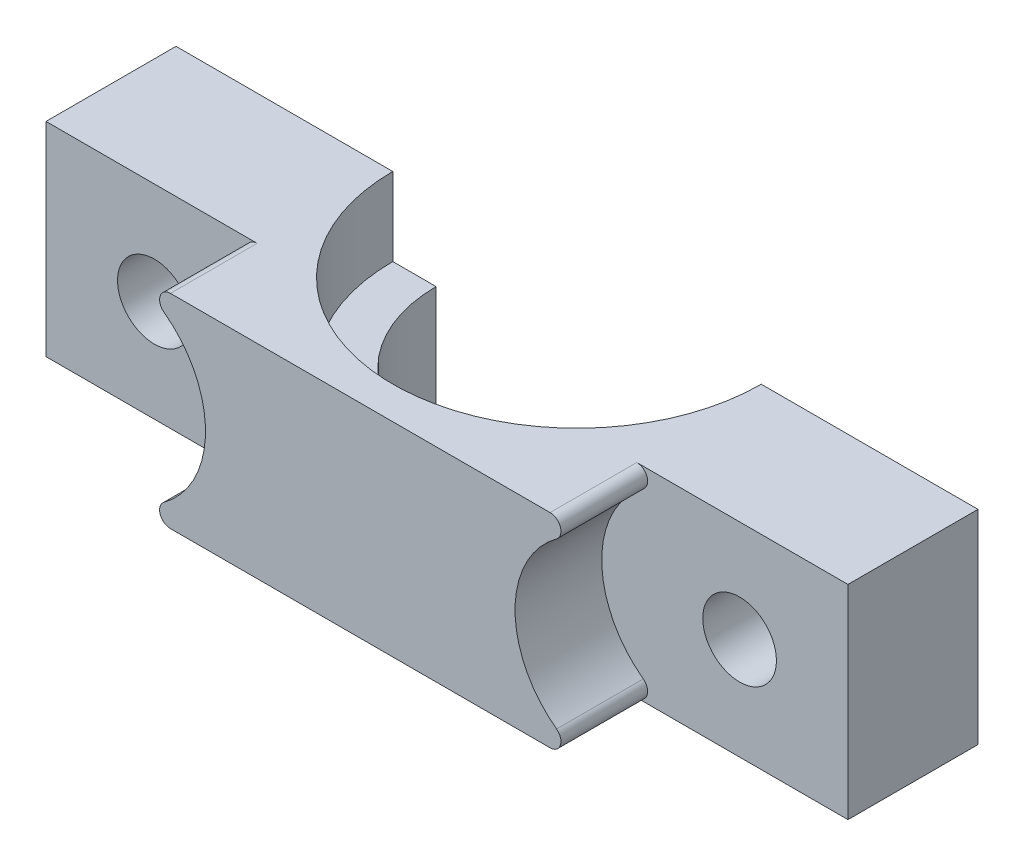
ISO-10303-21;
HEADER;
FILE_DESCRIPTION(('STEP AP214'),'2;1');
FILE_NAME('part.step','',(''),(''),'','','');
FILE_SCHEMA(('AUTOMOTIVE_DESIGN { 1 0 10303 214 1 1 1 1 }'));
ENDSEC;
DATA;
#1=APPLICATION_CONTEXT('core data for automotive mechanical design processes');
#2=APPLICATION_PROTOCOL_DEFINITION('international standard','automotive_design',2000,#1);
#3=PRODUCT_CONTEXT('',#1,'mechanical');
#4=PRODUCT('Part','Part','',(#3));
#5=PRODUCT_RELATED_PRODUCT_CATEGORY('part','',(#4));
#6=PRODUCT_DEFINITION_FORMATION('','',#4);
#7=PRODUCT_DEFINITION_CONTEXT('part definition',#1,'design');
#8=PRODUCT_DEFINITION('design','',#6,#7);
#9=PRODUCT_DEFINITION_SHAPE('','',#8);
#10=(LENGTH_UNIT() NAMED_UNIT(*) SI_UNIT(.MILLI.,.METRE.));
#11=(NAMED_UNIT(*) PLANE_ANGLE_UNIT() SI_UNIT($,.RADIAN.));
#12=(NAMED_UNIT(*) SI_UNIT($,.STERADIAN.) SOLID_ANGLE_UNIT());
#13=UNCERTAINTY_MEASURE_WITH_UNIT(LENGTH_MEASURE(1.E-05),#10,'distance_accuracy_value','');
#14=(GEOMETRIC_REPRESENTATION_CONTEXT(3) GLOBAL_UNCERTAINTY_ASSIGNED_CONTEXT((#13)) GLOBAL_UNIT_ASSIGNED_CONTEXT((#10,
#11,#12)) REPRESENTATION_CONTEXT('',''));
#15=CARTESIAN_POINT('',(0.,0.,0.));
#16=DIRECTION('',(0.,0.,1.));
#17=DIRECTION('',(1.,0.,0.));
#18=AXIS2_PLACEMENT_3D('',#15,#16,#17);
#19=CARTESIAN_POINT('',(-18.5,5.8,-9.99999999999999));
#20=DIRECTION('',(1.,0.,0.));
#21=DIRECTION('',(0.,0.,-1.));
#22=AXIS2_PLACEMENT_3D('',#19,#20,#21);
#23=PLANE('',#22);
#24=DIRECTION('',(0.,-1.,0.));
#25=VECTOR('',#24,1.);
#26=CARTESIAN_POINT('',(-18.5,9.4,-4.));
#27=LINE('',#26,#25);
#28=CARTESIAN_POINT('',(-18.5,9.4,-4.));
#29=VERTEX_POINT('',#28);
#30=CARTESIAN_POINT('',(-18.5,0.,-4.));
#31=VERTEX_POINT('',#30);
#32=EDGE_CURVE('E315',#29,#31,#27,.T.);
#33=ORIENTED_EDGE('',*,*,#32,.F.);
#34=DIRECTION('',(0.,0.,1.));
#35=VECTOR('',#34,1.);
#36=CARTESIAN_POINT('',(-18.5,9.4,-9.99999999999999));
#37=LINE('',#36,#35);
#38=CARTESIAN_POINT('',(-18.5,9.4,-9.99999999999999));
#39=VERTEX_POINT('',#38);
#40=EDGE_CURVE('E295',#39,#29,#37,.T.);
#41=ORIENTED_EDGE('',*,*,#40,.F.);
#42=DIRECTION('',(0.,-1.,0.));
#43=VECTOR('',#42,1.);
#44=CARTESIAN_POINT('',(-18.5,5.8,-9.99999999999999));
#45=LINE('',#44,#43);
#46=CARTESIAN_POINT('',(-18.5,0.,-9.99999999999999));
#47=VERTEX_POINT('',#46);
#48=EDGE_CURVE('E183',#39,#47,#45,.T.);
#49=ORIENTED_EDGE('',*,*,#48,.T.);
#50=DIRECTION('',(0.,0.,1.));
#51=VECTOR('',#50,1.);
#52=CARTESIAN_POINT('',(-18.5,0.,-9.99999999999999));
#53=LINE('',#52,#51);
#54=EDGE_CURVE('E175',#47,#31,#53,.T.);
#55=ORIENTED_EDGE('',*,*,#54,.T.);
#56=EDGE_LOOP('',(#33,#41,#49,#55));
#57=FACE_BOUND('',#56,.T.);
#58=ADVANCED_FACE('F36',(#57),#23,.F.);
#59=CARTESIAN_POINT('',(-13.5,4.7,0.));
#60=DIRECTION('',(0.,0.,1.));
#61=DIRECTION('',(1.,0.,0.));
#62=AXIS2_PLACEMENT_3D('',#59,#60,#61);
#63=CYLINDRICAL_SURFACE('',#62,1.69999999999999);
#64=CARTESIAN_POINT('',(-13.5,4.7,-10.));
#65=DIRECTION('',(0.,0.,1.));
#66=DIRECTION('',(1.,0.,0.));
#67=AXIS2_PLACEMENT_3D('',#64,#65,#66);
#68=CIRCLE('',#67,1.69999999999999);
#69=CARTESIAN_POINT('',(-11.8,4.7,-10.));
#70=VERTEX_POINT('',#69);
#71=EDGE_CURVE('E231',#70,#70,#68,.T.);
#72=ORIENTED_EDGE('',*,*,#71,.F.);
#73=EDGE_LOOP('',(#72));
#74=FACE_BOUND('',#73,.T.);
#75=CARTESIAN_POINT('',(-13.5,4.7,-4.));
#76=DIRECTION('',(0.,0.,1.));
#77=DIRECTION('',(1.,0.,0.));
#78=AXIS2_PLACEMENT_3D('',#75,#76,#77);
#79=CIRCLE('',#78,1.69999999999999);
#80=CARTESIAN_POINT('',(-11.8,4.7,-4.));
#81=VERTEX_POINT('',#80);
#82=EDGE_CURVE('E234',#81,#81,#79,.F.);
#83=ORIENTED_EDGE('',*,*,#82,.F.);
#84=EDGE_LOOP('',(#83));
#85=FACE_BOUND('',#84,.T.);
#86=ADVANCED_FACE('F349',(#74,#85),#63,.F.);
#87=CARTESIAN_POINT('',(0.,5.8,-9.99999999999999));
#88=DIRECTION('',(0.,-1.,0.));
#89=DIRECTION('',(0.,0.,-1.));
#90=AXIS2_PLACEMENT_3D('',#87,#88,#89);
#91=PLANE('',#90);
#92=CARTESIAN_POINT('',(0.,5.8,-9.99999999999999));
#93=DIRECTION('',(0.,-1.,0.));
#94=DIRECTION('',(0.,0.,1.));
#95=AXIS2_PLACEMENT_3D('',#92,#93,#94);
#96=CIRCLE('',#95,8.5);
#97=CARTESIAN_POINT('',(8.5,5.8,-10.));
#98=VERTEX_POINT('',#97);
#99=CARTESIAN_POINT('',(-8.5,5.8,-10.));
#100=VERTEX_POINT('',#99);
#101=EDGE_CURVE('E230',#98,#100,#96,.T.);
#102=ORIENTED_EDGE('',*,*,#101,.F.);
#103=DIRECTION('',(-1.,0.,0.));
#104=VECTOR('',#103,1.);
#105=CARTESIAN_POINT('',(18.5,5.8,-10.));
#106=LINE('',#105,#104);
#107=CARTESIAN_POINT('',(6.5,5.8,-10.));
#108=VERTEX_POINT('',#107);
#109=EDGE_CURVE('E182',#98,#108,#106,.T.);
#110=ORIENTED_EDGE('',*,*,#109,.T.);
#111=CARTESIAN_POINT('',(0.,5.8,-9.99999999999999));
#112=DIRECTION('',(0.,-1.,0.));
#113=DIRECTION('',(0.,0.,-1.));
#114=AXIS2_PLACEMENT_3D('',#111,#112,#113);
#115=CIRCLE('',#114,6.5);
#116=CARTESIAN_POINT('',(-6.5,5.8,-10.));
#117=VERTEX_POINT('',#116);
#118=EDGE_CURVE('E198',#108,#117,#115,.T.);
#119=ORIENTED_EDGE('',*,*,#118,.T.);
#120=DIRECTION('',(-1.,0.,0.));
#121=VECTOR('',#120,1.);
#122=CARTESIAN_POINT('',(-6.5,5.8,-10.));
#123=LINE('',#122,#121);
#124=EDGE_CURVE('E187',#117,#100,#123,.T.);
#125=ORIENTED_EDGE('',*,*,#124,.T.);
#126=EDGE_LOOP('',(#102,#110,#119,#125));
#127=FACE_BOUND('',#126,.T.);
#128=ADVANCED_FACE('F354',(#127),#91,.F.);
#129=CARTESIAN_POINT('',(-18.5,5.8,0.));
#130=DIRECTION('',(0.,0.,-1.));
#131=DIRECTION('',(-1.,0.,0.));
#132=AXIS2_PLACEMENT_3D('',#129,#130,#131);
#133=PLANE('',#132);
#134=CARTESIAN_POINT('',(11.8633873406451,4.7,0.));
#135=DIRECTION('',(0.,0.,1.));
#136=DIRECTION('',(-1.,0.,0.));
#137=AXIS2_PLACEMENT_3D('',#134,#135,#136);
#138=CIRCLE('',#137,4.72322755184711);
#139=CARTESIAN_POINT('',(9.05545994025603,8.49794973909238,0.));
#140=VERTEX_POINT('',#139);
#141=CARTESIAN_POINT('',(9.05545994025604,0.902050260907619,0.));
#142=VERTEX_POINT('',#141);
#143=EDGE_CURVE('E319',#140,#142,#138,.T.);
#144=ORIENTED_EDGE('',*,*,#143,.F.);
#145=CARTESIAN_POINT('',(8.75821326205069,8.9,0.));
#146=DIRECTION('',(0.,0.,-1.));
#147=DIRECTION('',(-1.,0.,0.));
#148=AXIS2_PLACEMENT_3D('',#145,#146,#147);
#149=CIRCLE('',#148,0.5);
#150=CARTESIAN_POINT('',(8.75821326205069,9.4,0.));
#151=VERTEX_POINT('',#150);
#152=EDGE_CURVE('E251',#140,#151,#149,.F.);
#153=ORIENTED_EDGE('',*,*,#152,.T.);
#154=DIRECTION('',(1.,0.,0.));
#155=VECTOR('',#154,1.);
#156=CARTESIAN_POINT('',(-18.5,9.4,0.));
#157=LINE('',#156,#155);
#158=CARTESIAN_POINT('',(-8.75821326205069,9.4,0.));
#159=VERTEX_POINT('',#158);
#160=EDGE_CURVE('E287',#159,#151,#157,.T.);
#161=ORIENTED_EDGE('',*,*,#160,.F.);
#162=CARTESIAN_POINT('',(-8.75821326205069,8.9,0.));
#163=DIRECTION('',(0.,0.,-1.));
#164=DIRECTION('',(-1.,0.,0.));
#165=AXIS2_PLACEMENT_3D('',#162,#163,#164);
#166=CIRCLE('',#165,0.5);
#167=CARTESIAN_POINT('',(-9.05545994025604,8.49794973909238,0.));
#168=VERTEX_POINT('',#167);
#169=EDGE_CURVE('E249',#159,#168,#166,.F.);
#170=ORIENTED_EDGE('',*,*,#169,.T.);
#171=CARTESIAN_POINT('',(-11.8633873406451,4.7,0.));
#172=DIRECTION('',(0.,0.,1.));
#173=DIRECTION('',(1.,0.,0.));
#174=AXIS2_PLACEMENT_3D('',#171,#172,#173);
#175=CIRCLE('',#174,4.72322755184711);
#176=CARTESIAN_POINT('',(-9.05545994025604,0.90205026090762,0.));
#177=VERTEX_POINT('',#176);
#178=EDGE_CURVE('E240',#177,#168,#175,.T.);
#179=ORIENTED_EDGE('',*,*,#178,.F.);
#180=CARTESIAN_POINT('',(-8.75821326205069,0.5,0.));
#181=DIRECTION('',(0.,0.,-1.));
#182=DIRECTION('',(-1.,0.,0.));
#183=AXIS2_PLACEMENT_3D('',#180,#181,#182);
#184=CIRCLE('',#183,0.5);
#185=CARTESIAN_POINT('',(-8.75821326205069,0.,0.));
#186=VERTEX_POINT('',#185);
#187=EDGE_CURVE('E245',#177,#186,#184,.F.);
#188=ORIENTED_EDGE('',*,*,#187,.T.);
#189=DIRECTION('',(1.,0.,0.));
#190=VECTOR('',#189,1.);
#191=CARTESIAN_POINT('',(-18.5,0.,0.));
#192=LINE('',#191,#190);
#193=CARTESIAN_POINT('',(8.75821326205069,0.,0.));
#194=VERTEX_POINT('',#193);
#195=EDGE_CURVE('E170',#186,#194,#192,.T.);
#196=ORIENTED_EDGE('',*,*,#195,.T.);
#197=CARTESIAN_POINT('',(8.75821326205069,0.5,0.));
#198=DIRECTION('',(0.,0.,-1.));
#199=DIRECTION('',(-1.,0.,0.));
#200=AXIS2_PLACEMENT_3D('',#197,#198,#199);
#201=CIRCLE('',#200,0.5);
#202=EDGE_CURVE('E247',#194,#142,#201,.F.);
#203=ORIENTED_EDGE('',*,*,#202,.T.);
#204=EDGE_LOOP('',(#144,#153,#161,#170,#179,#188,#196,#203));
#205=FACE_BOUND('',#204,.T.);
#206=ADVANCED_FACE('F292',(#205),#133,.F.);
#207=CARTESIAN_POINT('',(18.5,5.8,0.));
#208=DIRECTION('',(-1.,0.,0.));
#209=DIRECTION('',(0.,0.,1.));
#210=AXIS2_PLACEMENT_3D('',#207,#208,#209);
#211=PLANE('',#210);
#212=DIRECTION('',(0.,0.,-1.));
#213=VECTOR('',#212,1.);
#214=CARTESIAN_POINT('',(18.5,9.4,0.));
#215=LINE('',#214,#213);
#216=CARTESIAN_POINT('',(18.5,9.4,-4.));
#217=VERTEX_POINT('',#216);
#218=CARTESIAN_POINT('',(18.5,9.4,-10.));
#219=VERTEX_POINT('',#218);
#220=EDGE_CURVE('E163',#217,#219,#215,.T.);
#221=ORIENTED_EDGE('',*,*,#220,.F.);
#222=DIRECTION('',(0.,1.,0.));
#223=VECTOR('',#222,1.);
#224=CARTESIAN_POINT('',(18.5,9.4,-4.));
#225=LINE('',#224,#223);
#226=CARTESIAN_POINT('',(18.5,0.,-4.));
#227=VERTEX_POINT('',#226);
#228=EDGE_CURVE('E150',#227,#217,#225,.T.);
#229=ORIENTED_EDGE('',*,*,#228,.F.);
#230=DIRECTION('',(0.,0.,-1.));
#231=VECTOR('',#230,1.);
#232=CARTESIAN_POINT('',(18.5,0.,0.));
#233=LINE('',#232,#231);
#234=CARTESIAN_POINT('',(18.5,0.,-10.));
#235=VERTEX_POINT('',#234);
#236=EDGE_CURVE('E161',#227,#235,#233,.T.);
#237=ORIENTED_EDGE('',*,*,#236,.T.);
#238=DIRECTION('',(0.,-1.,0.));
#239=VECTOR('',#238,1.);
#240=CARTESIAN_POINT('',(18.5,5.8,-10.));
#241=LINE('',#240,#239);
#242=EDGE_CURVE('E193',#219,#235,#241,.T.);
#243=ORIENTED_EDGE('',*,*,#242,.F.);
#244=EDGE_LOOP('',(#221,#229,#237,#243));
#245=FACE_BOUND('',#244,.T.);
#246=ADVANCED_FACE('F159',(#245),#211,.F.);
#247=CARTESIAN_POINT('',(18.5,5.8,-10.));
#248=DIRECTION('',(0.,0.,1.));
#249=DIRECTION('',(1.,0.,0.));
#250=AXIS2_PLACEMENT_3D('',#247,#248,#249);
#251=PLANE('',#250);
#252=CARTESIAN_POINT('',(13.5,4.7,-10.));
#253=DIRECTION('',(0.,0.,1.));
#254=DIRECTION('',(1.,0.,0.));
#255=AXIS2_PLACEMENT_3D('',#252,#253,#254);
#256=CIRCLE('',#255,1.69999999999999);
#257=CARTESIAN_POINT('',(15.2,4.7,-10.));
#258=VERTEX_POINT('',#257);
#259=EDGE_CURVE('E227',#258,#258,#256,.T.);
#260=ORIENTED_EDGE('',*,*,#259,.T.);
#261=EDGE_LOOP('',(#260));
#262=FACE_BOUND('',#261,.T.);
#263=DIRECTION('',(-1.,0.,0.));
#264=VECTOR('',#263,1.);
#265=CARTESIAN_POINT('',(18.5,0.,-10.));
#266=LINE('',#265,#264);
#267=CARTESIAN_POINT('',(6.5,0.,-10.));
#268=VERTEX_POINT('',#267);
#269=EDGE_CURVE('E169',#235,#268,#266,.T.);
#270=ORIENTED_EDGE('',*,*,#269,.T.);
#271=DIRECTION('',(0.,-1.,0.));
#272=VECTOR('',#271,1.);
#273=CARTESIAN_POINT('',(6.5,5.8,-10.));
#274=LINE('',#273,#272);
#275=EDGE_CURVE('E190',#108,#268,#274,.T.);
#276=ORIENTED_EDGE('',*,*,#275,.F.);
#277=ORIENTED_EDGE('',*,*,#109,.F.);
#278=DIRECTION('',(0.,-1.,0.));
#279=VECTOR('',#278,1.);
#280=CARTESIAN_POINT('',(8.5,9.4,-10.));
#281=LINE('',#280,#279);
#282=CARTESIAN_POINT('',(8.5,9.4,-10.));
#283=VERTEX_POINT('',#282);
#284=EDGE_CURVE('E208',#283,#98,#281,.T.);
#285=ORIENTED_EDGE('',*,*,#284,.F.);
#286=DIRECTION('',(-1.,0.,0.));
#287=VECTOR('',#286,1.);
#288=CARTESIAN_POINT('',(18.5,9.4,-10.));
#289=LINE('',#288,#287);
#290=EDGE_CURVE('E297',#219,#283,#289,.T.);
#291=ORIENTED_EDGE('',*,*,#290,.F.);
#292=ORIENTED_EDGE('',*,*,#242,.T.);
#293=EDGE_LOOP('',(#270,#276,#277,#285,#291,#292));
#294=FACE_BOUND('',#293,.T.);
#295=ADVANCED_FACE('F460',(#262,#294),#251,.F.);
#296=CARTESIAN_POINT('',(0.,5.8,-9.99999999999999));
#297=DIRECTION('',(0.,-1.,0.));
#298=DIRECTION('',(0.,0.,-1.));
#299=AXIS2_PLACEMENT_3D('',#296,#297,#298);
#300=CYLINDRICAL_SURFACE('',#299,6.5);
#301=CARTESIAN_POINT('',(0.,0.,-9.99999999999999));
#302=DIRECTION('',(0.,-1.,0.));
#303=DIRECTION('',(0.,0.,-1.));
#304=AXIS2_PLACEMENT_3D('',#301,#302,#303);
#305=CIRCLE('',#304,6.5);
#306=CARTESIAN_POINT('',(-6.5,0.,-10.));
#307=VERTEX_POINT('',#306);
#308=EDGE_CURVE('E172',#268,#307,#305,.T.);
#309=ORIENTED_EDGE('',*,*,#308,.T.);
#310=DIRECTION('',(0.,-1.,0.));
#311=VECTOR('',#310,1.);
#312=CARTESIAN_POINT('',(-6.5,5.8,-10.));
#313=LINE('',#312,#311);
#314=EDGE_CURVE('E186',#117,#307,#313,.T.);
#315=ORIENTED_EDGE('',*,*,#314,.F.);
#316=ORIENTED_EDGE('',*,*,#118,.F.);
#317=ORIENTED_EDGE('',*,*,#275,.T.);
#318=EDGE_LOOP('',(#309,#315,#316,#317));
#319=FACE_BOUND('',#318,.T.);
#320=ADVANCED_FACE('F479',(#319),#300,.F.);
#321=CARTESIAN_POINT('',(-6.5,5.8,-10.));
#322=DIRECTION('',(0.,0.,1.));
#323=DIRECTION('',(1.,0.,0.));
#324=AXIS2_PLACEMENT_3D('',#321,#322,#323);
#325=PLANE('',#324);
#326=ORIENTED_EDGE('',*,*,#71,.T.);
#327=EDGE_LOOP('',(#326));
#328=FACE_BOUND('',#327,.T.);
#329=DIRECTION('',(-1.,0.,0.));
#330=VECTOR('',#329,1.);
#331=CARTESIAN_POINT('',(-6.5,0.,-10.));
#332=LINE('',#331,#330);
#333=EDGE_CURVE('E180',#307,#47,#332,.T.);
#334=ORIENTED_EDGE('',*,*,#333,.T.);
#335=ORIENTED_EDGE('',*,*,#48,.F.);
#336=DIRECTION('',(-1.,0.,0.));
#337=VECTOR('',#336,1.);
#338=CARTESIAN_POINT('',(-18.5,9.4,-9.99999999999999));
#339=LINE('',#338,#337);
#340=CARTESIAN_POINT('',(-8.5,9.4,-10.));
#341=VERTEX_POINT('',#340);
#342=EDGE_CURVE('E299',#341,#39,#339,.T.);
#343=ORIENTED_EDGE('',*,*,#342,.F.);
#344=DIRECTION('',(0.,-1.,0.));
#345=VECTOR('',#344,1.);
#346=CARTESIAN_POINT('',(-8.5,9.4,-10.));
#347=LINE('',#346,#345);
#348=EDGE_CURVE('E213',#341,#100,#347,.T.);
#349=ORIENTED_EDGE('',*,*,#348,.T.);
#350=ORIENTED_EDGE('',*,*,#124,.F.);
#351=ORIENTED_EDGE('',*,*,#314,.T.);
#352=EDGE_LOOP('',(#334,#335,#343,#349,#350,#351));
#353=FACE_BOUND('',#352,.T.);
#354=ADVANCED_FACE('F310',(#328,#353),#325,.F.);
#355=CARTESIAN_POINT('',(0.,0.,-9.99999999999999));
#356=DIRECTION('',(0.,-1.,0.));
#357=DIRECTION('',(0.,0.,-1.));
#358=AXIS2_PLACEMENT_3D('',#355,#356,#357);
#359=PLANE('',#358);
#360=DIRECTION('',(1.,0.,0.));
#361=VECTOR('',#360,1.);
#362=CARTESIAN_POINT('',(18.5,0.,-4.));
#363=LINE('',#362,#361);
#364=CARTESIAN_POINT('',(8.75821326205069,0.,-4.));
#365=VERTEX_POINT('',#364);
#366=EDGE_CURVE('E51',#365,#227,#363,.T.);
#367=ORIENTED_EDGE('',*,*,#366,.F.);
#368=DIRECTION('',(0.,0.,-1.));
#369=VECTOR('',#368,1.);
#370=CARTESIAN_POINT('',(8.75821326205069,0.,0.));
#371=LINE('',#370,#369);
#372=EDGE_CURVE('E266',#365,#194,#371,.F.);
#373=ORIENTED_EDGE('',*,*,#372,.T.);
#374=ORIENTED_EDGE('',*,*,#195,.F.);
#375=DIRECTION('',(0.,0.,-1.));
#376=VECTOR('',#375,1.);
#377=CARTESIAN_POINT('',(-8.75821326205069,0.,-4.));
#378=LINE('',#377,#376);
#379=CARTESIAN_POINT('',(-8.75821326205069,0.,-4.));
#380=VERTEX_POINT('',#379);
#381=EDGE_CURVE('E264',#186,#380,#378,.T.);
#382=ORIENTED_EDGE('',*,*,#381,.T.);
#383=DIRECTION('',(1.,0.,0.));
#384=VECTOR('',#383,1.);
#385=CARTESIAN_POINT('',(-18.5,0.,-4.));
#386=LINE('',#385,#384);
#387=EDGE_CURVE('E58',#31,#380,#386,.T.);
#388=ORIENTED_EDGE('',*,*,#387,.F.);
#389=ORIENTED_EDGE('',*,*,#54,.F.);
#390=ORIENTED_EDGE('',*,*,#333,.F.);
#391=ORIENTED_EDGE('',*,*,#308,.F.);
#392=ORIENTED_EDGE('',*,*,#269,.F.);
#393=ORIENTED_EDGE('',*,*,#236,.F.);
#394=EDGE_LOOP('',(#367,#373,#374,#382,#388,#389,#390,#391,#392,#393));
#395=FACE_BOUND('',#394,.T.);
#396=ADVANCED_FACE('F167',(#395),#359,.T.);
#397=CARTESIAN_POINT('',(0.,9.4,-9.99999999999999));
#398=DIRECTION('',(0.,-1.,0.));
#399=DIRECTION('',(0.,0.,-1.));
#400=AXIS2_PLACEMENT_3D('',#397,#398,#399);
#401=CYLINDRICAL_SURFACE('',#400,8.5);
#402=ORIENTED_EDGE('',*,*,#101,.T.);
#403=ORIENTED_EDGE('',*,*,#348,.F.);
#404=CARTESIAN_POINT('',(0.,9.4,-9.99999999999999));
#405=DIRECTION('',(0.,-1.,0.));
#406=DIRECTION('',(0.,0.,1.));
#407=AXIS2_PLACEMENT_3D('',#404,#405,#406);
#408=CIRCLE('',#407,8.5);
#409=EDGE_CURVE('E220',#283,#341,#408,.T.);
#410=ORIENTED_EDGE('',*,*,#409,.F.);
#411=ORIENTED_EDGE('',*,*,#284,.T.);
#412=EDGE_LOOP('',(#402,#403,#410,#411));
#413=FACE_BOUND('',#412,.T.);
#414=ADVANCED_FACE('F307',(#413),#401,.F.);
#415=CARTESIAN_POINT('',(0.,9.4,-9.99999999999999));
#416=DIRECTION('',(0.,1.,0.));
#417=DIRECTION('',(0.,0.,1.));
#418=AXIS2_PLACEMENT_3D('',#415,#416,#417);
#419=PLANE('',#418);
#420=ORIENTED_EDGE('',*,*,#160,.T.);
#421=DIRECTION('',(0.,0.,-1.));
#422=VECTOR('',#421,1.);
#423=CARTESIAN_POINT('',(8.75821326205069,9.4,-4.));
#424=LINE('',#423,#422);
#425=CARTESIAN_POINT('',(8.75821326205069,9.40000000000001,-4.));
#426=VERTEX_POINT('',#425);
#427=EDGE_CURVE('E256',#151,#426,#424,.T.);
#428=ORIENTED_EDGE('',*,*,#427,.T.);
#429=DIRECTION('',(-1.,0.,0.));
#430=VECTOR('',#429,1.);
#431=CARTESIAN_POINT('',(11.3955428082119,9.40000000000001,-4.));
#432=LINE('',#431,#430);
#433=EDGE_CURVE('E164',#217,#426,#432,.T.);
#434=ORIENTED_EDGE('',*,*,#433,.F.);
#435=ORIENTED_EDGE('',*,*,#220,.T.);
#436=ORIENTED_EDGE('',*,*,#290,.T.);
#437=ORIENTED_EDGE('',*,*,#409,.T.);
#438=ORIENTED_EDGE('',*,*,#342,.T.);
#439=ORIENTED_EDGE('',*,*,#40,.T.);
#440=DIRECTION('',(-1.,0.,0.));
#441=VECTOR('',#440,1.);
#442=CARTESIAN_POINT('',(-11.3955428082119,9.40000000000001,-4.));
#443=LINE('',#442,#441);
#444=CARTESIAN_POINT('',(-8.75821326205069,9.40000000000001,-4.));
#445=VERTEX_POINT('',#444);
#446=EDGE_CURVE('E277',#445,#29,#443,.T.);
#447=ORIENTED_EDGE('',*,*,#446,.F.);
#448=DIRECTION('',(0.,0.,-1.));
#449=VECTOR('',#448,1.);
#450=CARTESIAN_POINT('',(-8.75821326205069,9.4,0.));
#451=LINE('',#450,#449);
#452=EDGE_CURVE('E253',#445,#159,#451,.F.);
#453=ORIENTED_EDGE('',*,*,#452,.T.);
#454=EDGE_LOOP('',(#420,#428,#434,#435,#436,#437,#438,#439,#447,#453));
#455=FACE_BOUND('',#454,.T.);
#456=ADVANCED_FACE('F286',(#455),#419,.T.);
#457=CARTESIAN_POINT('',(13.5,4.7,0.));
#458=DIRECTION('',(0.,0.,1.));
#459=DIRECTION('',(1.,0.,0.));
#460=AXIS2_PLACEMENT_3D('',#457,#458,#459);
#461=CYLINDRICAL_SURFACE('',#460,1.69999999999999);
#462=CARTESIAN_POINT('',(13.5,4.7,-4.));
#463=DIRECTION('',(0.,0.,-1.));
#464=DIRECTION('',(-1.,0.,0.));
#465=AXIS2_PLACEMENT_3D('',#462,#463,#464);
#466=CIRCLE('',#465,1.69999999999999);
#467=CARTESIAN_POINT('',(11.8,4.7,-4.));
#468=VERTEX_POINT('',#467);
#469=EDGE_CURVE('E237',#468,#468,#466,.F.);
#470=ORIENTED_EDGE('',*,*,#469,.T.);
#471=EDGE_LOOP('',(#470));
#472=FACE_BOUND('',#471,.T.);
#473=ORIENTED_EDGE('',*,*,#259,.F.);
#474=EDGE_LOOP('',(#473));
#475=FACE_BOUND('',#474,.T.);
#476=ADVANCED_FACE('F345',(#472,#475),#461,.F.);
#477=CARTESIAN_POINT('',(-11.8633873406451,4.7,-4.));
#478=DIRECTION('',(0.,0.,1.));
#479=DIRECTION('',(1.,0.,0.));
#480=AXIS2_PLACEMENT_3D('',#477,#478,#479);
#481=PLANE('',#480);
#482=ORIENTED_EDGE('',*,*,#387,.T.);
#483=CARTESIAN_POINT('',(-8.75821326205069,0.5,-4.));
#484=DIRECTION('',(0.,0.,1.));
#485=DIRECTION('',(1.,0.,0.));
#486=AXIS2_PLACEMENT_3D('',#483,#484,#485);
#487=CIRCLE('',#486,0.5);
#488=CARTESIAN_POINT('',(-9.05545994025604,0.90205026090762,-4.));
#489=VERTEX_POINT('',#488);
#490=EDGE_CURVE('E11',#380,#489,#487,.F.);
#491=ORIENTED_EDGE('',*,*,#490,.T.);
#492=CARTESIAN_POINT('',(-11.8633873406451,4.7,-4.));
#493=DIRECTION('',(0.,0.,1.));
#494=DIRECTION('',(1.,0.,0.));
#495=AXIS2_PLACEMENT_3D('',#492,#493,#494);
#496=CIRCLE('',#495,4.72322755184711);
#497=CARTESIAN_POINT('',(-9.05545994025604,8.49794973909238,-4.));
#498=VERTEX_POINT('',#497);
#499=EDGE_CURVE('E279',#489,#498,#496,.T.);
#500=ORIENTED_EDGE('',*,*,#499,.T.);
#501=CARTESIAN_POINT('',(-8.75821326205069,8.9,-4.));
#502=DIRECTION('',(0.,0.,1.));
#503=DIRECTION('',(1.,0.,0.));
#504=AXIS2_PLACEMENT_3D('',#501,#502,#503);
#505=CIRCLE('',#504,0.5);
#506=EDGE_CURVE('E270',#498,#445,#505,.F.);
#507=ORIENTED_EDGE('',*,*,#506,.T.);
#508=ORIENTED_EDGE('',*,*,#446,.T.);
#509=ORIENTED_EDGE('',*,*,#32,.T.);
#510=EDGE_LOOP('',(#482,#491,#500,#507,#508,#509));
#511=FACE_BOUND('',#510,.T.);
#512=ORIENTED_EDGE('',*,*,#82,.T.);
#513=EDGE_LOOP('',(#512));
#514=FACE_BOUND('',#513,.T.);
#515=ADVANCED_FACE('F275',(#511,#514),#481,.T.);
#516=CARTESIAN_POINT('',(-11.8633873406451,4.7,-4.));
#517=DIRECTION('',(0.,0.,1.));
#518=DIRECTION('',(1.,0.,0.));
#519=AXIS2_PLACEMENT_3D('',#516,#517,#518);
#520=CYLINDRICAL_SURFACE('',#519,4.72322755184711);
#521=ORIENTED_EDGE('',*,*,#178,.T.);
#522=DIRECTION('',(0.,0.,1.));
#523=VECTOR('',#522,1.);
#524=CARTESIAN_POINT('',(-9.05545994025604,8.49794973909238,-4.));
#525=LINE('',#524,#523);
#526=EDGE_CURVE('E262',#168,#498,#525,.F.);
#527=ORIENTED_EDGE('',*,*,#526,.T.);
#528=ORIENTED_EDGE('',*,*,#499,.F.);
#529=DIRECTION('',(0.,0.,1.));
#530=VECTOR('',#529,1.);
#531=CARTESIAN_POINT('',(-9.05545994025604,0.90205026090762,-4.));
#532=LINE('',#531,#530);
#533=EDGE_CURVE('E259',#489,#177,#532,.T.);
#534=ORIENTED_EDGE('',*,*,#533,.T.);
#535=EDGE_LOOP('',(#521,#527,#528,#534));
#536=FACE_BOUND('',#535,.T.);
#537=ADVANCED_FACE('F336',(#536),#520,.F.);
#538=CARTESIAN_POINT('',(11.8633873406451,4.7,-4.));
#539=DIRECTION('',(0.,0.,-1.));
#540=DIRECTION('',(-1.,0.,0.));
#541=AXIS2_PLACEMENT_3D('',#538,#539,#540);
#542=PLANE('',#541);
#543=ORIENTED_EDGE('',*,*,#433,.T.);
#544=CARTESIAN_POINT('',(8.75821326205069,8.9,-4.));
#545=DIRECTION('',(0.,0.,-1.));
#546=DIRECTION('',(-1.,0.,0.));
#547=AXIS2_PLACEMENT_3D('',#544,#545,#546);
#548=CIRCLE('',#547,0.5);
#549=CARTESIAN_POINT('',(9.05545994025603,8.49794973909238,-4.));
#550=VERTEX_POINT('',#549);
#551=EDGE_CURVE('E268',#426,#550,#548,.T.);
#552=ORIENTED_EDGE('',*,*,#551,.T.);
#553=CARTESIAN_POINT('',(11.8633873406451,4.7,-4.));
#554=DIRECTION('',(0.,0.,1.));
#555=DIRECTION('',(-1.,0.,0.));
#556=AXIS2_PLACEMENT_3D('',#553,#554,#555);
#557=CIRCLE('',#556,4.72322755184711);
#558=CARTESIAN_POINT('',(9.05545994025604,0.902050260907619,-4.));
#559=VERTEX_POINT('',#558);
#560=EDGE_CURVE('E155',#550,#559,#557,.T.);
#561=ORIENTED_EDGE('',*,*,#560,.T.);
#562=CARTESIAN_POINT('',(8.75821326205069,0.5,-4.));
#563=DIRECTION('',(0.,0.,-1.));
#564=DIRECTION('',(-1.,0.,0.));
#565=AXIS2_PLACEMENT_3D('',#562,#563,#564);
#566=CIRCLE('',#565,0.5);
#567=EDGE_CURVE('E44',#559,#365,#566,.T.);
#568=ORIENTED_EDGE('',*,*,#567,.T.);
#569=ORIENTED_EDGE('',*,*,#366,.T.);
#570=ORIENTED_EDGE('',*,*,#228,.T.);
#571=EDGE_LOOP('',(#543,#552,#561,#568,#569,#570));
#572=FACE_BOUND('',#571,.T.);
#573=ORIENTED_EDGE('',*,*,#469,.F.);
#574=EDGE_LOOP('',(#573));
#575=FACE_BOUND('',#574,.T.);
#576=ADVANCED_FACE('F148',(#572,#575),#542,.F.);
#577=CARTESIAN_POINT('',(11.8633873406451,4.7,-4.));
#578=DIRECTION('',(0.,0.,1.));
#579=DIRECTION('',(1.,0.,0.));
#580=AXIS2_PLACEMENT_3D('',#577,#578,#579);
#581=CYLINDRICAL_SURFACE('',#580,4.72322755184711);
#582=ORIENTED_EDGE('',*,*,#560,.F.);
#583=DIRECTION('',(0.,0.,1.));
#584=VECTOR('',#583,1.);
#585=CARTESIAN_POINT('',(9.05545994025603,8.49794973909238,-4.));
#586=LINE('',#585,#584);
#587=EDGE_CURVE('E242',#550,#140,#586,.T.);
#588=ORIENTED_EDGE('',*,*,#587,.T.);
#589=ORIENTED_EDGE('',*,*,#143,.T.);
#590=DIRECTION('',(0.,0.,1.));
#591=VECTOR('',#590,1.);
#592=CARTESIAN_POINT('',(9.05545994025604,0.902050260907619,-4.));
#593=LINE('',#592,#591);
#594=EDGE_CURVE('E195',#142,#559,#593,.F.);
#595=ORIENTED_EDGE('',*,*,#594,.T.);
#596=EDGE_LOOP('',(#582,#588,#589,#595));
#597=FACE_BOUND('',#596,.T.);
#598=ADVANCED_FACE('F343',(#597),#581,.F.);
#599=CARTESIAN_POINT('',(8.75821326205069,8.9,-4.));
#600=DIRECTION('',(0.,0.,1.));
#601=DIRECTION('',(1.,0.,0.));
#602=AXIS2_PLACEMENT_3D('',#599,#600,#601);
#603=CYLINDRICAL_SURFACE('',#602,0.5);
#604=ORIENTED_EDGE('',*,*,#551,.F.);
#605=ORIENTED_EDGE('',*,*,#427,.F.);
#606=ORIENTED_EDGE('',*,*,#152,.F.);
#607=ORIENTED_EDGE('',*,*,#587,.F.);
#608=EDGE_LOOP('',(#604,#605,#606,#607));
#609=FACE_BOUND('',#608,.T.);
#610=ADVANCED_FACE('F359',(#609),#603,.T.);
#611=CARTESIAN_POINT('',(-8.75821326205069,8.9,-4.));
#612=DIRECTION('',(0.,0.,1.));
#613=DIRECTION('',(1.,0.,0.));
#614=AXIS2_PLACEMENT_3D('',#611,#612,#613);
#615=CYLINDRICAL_SURFACE('',#614,0.5);
#616=ORIENTED_EDGE('',*,*,#506,.F.);
#617=ORIENTED_EDGE('',*,*,#526,.F.);
#618=ORIENTED_EDGE('',*,*,#169,.F.);
#619=ORIENTED_EDGE('',*,*,#452,.F.);
#620=EDGE_LOOP('',(#616,#617,#618,#619));
#621=FACE_BOUND('',#620,.T.);
#622=ADVANCED_FACE('F282',(#621),#615,.T.);
#623=CARTESIAN_POINT('',(8.75821326205069,0.5,-4.));
#624=DIRECTION('',(0.,0.,1.));
#625=DIRECTION('',(1.,0.,0.));
#626=AXIS2_PLACEMENT_3D('',#623,#624,#625);
#627=CYLINDRICAL_SURFACE('',#626,0.5);
#628=ORIENTED_EDGE('',*,*,#567,.F.);
#629=ORIENTED_EDGE('',*,*,#594,.F.);
#630=ORIENTED_EDGE('',*,*,#202,.F.);
#631=ORIENTED_EDGE('',*,*,#372,.F.);
#632=EDGE_LOOP('',(#628,#629,#630,#631));
#633=FACE_BOUND('',#632,.T.);
#634=ADVANCED_FACE('F329',(#633),#627,.T.);
#635=CARTESIAN_POINT('',(-8.75821326205069,0.5,-4.));
#636=DIRECTION('',(0.,0.,1.));
#637=DIRECTION('',(1.,0.,0.));
#638=AXIS2_PLACEMENT_3D('',#635,#636,#637);
#639=CYLINDRICAL_SURFACE('',#638,0.5);
#640=ORIENTED_EDGE('',*,*,#490,.F.);
#641=ORIENTED_EDGE('',*,*,#381,.F.);
#642=ORIENTED_EDGE('',*,*,#187,.F.);
#643=ORIENTED_EDGE('',*,*,#533,.F.);
#644=EDGE_LOOP('',(#640,#641,#642,#643));
#645=FACE_BOUND('',#644,.T.);
#646=ADVANCED_FACE('F38',(#645),#639,.T.);
#647=CLOSED_SHELL('',(#58,#86,#128,#206,#246,#295,#320,#354,#396,#414,#456,#476,#515,#537,#576,
#598,#610,#622,#634,#646));
#648=MANIFOLD_SOLID_BREP('B2',#647);
#649=ADVANCED_BREP_SHAPE_REPRESENTATION('',(#18,#648),#14);
#650=SHAPE_DEFINITION_REPRESENTATION(#9,#649);
ENDSEC;
END-ISO-10303-21;
